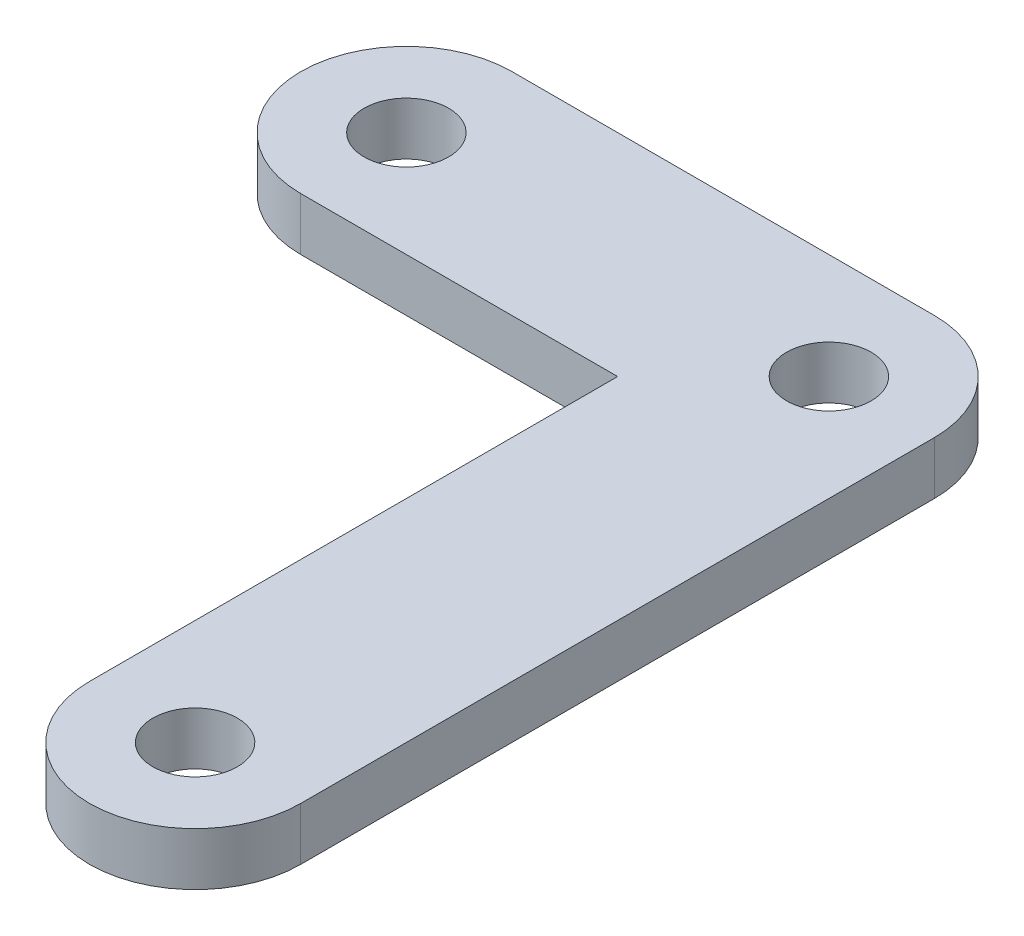
ISO-10303-21;
HEADER;
FILE_DESCRIPTION(('STEP AP214'),'2;1');
FILE_NAME('part.step','',(''),(''),'','','');
FILE_SCHEMA(('AUTOMOTIVE_DESIGN { 1 0 10303 214 1 1 1 1 }'));
ENDSEC;
DATA;
#1=APPLICATION_CONTEXT('core data for automotive mechanical design processes');
#2=APPLICATION_PROTOCOL_DEFINITION('international standard','automotive_design',2000,#1);
#3=PRODUCT_CONTEXT('',#1,'mechanical');
#4=PRODUCT('Part','Part','',(#3));
#5=PRODUCT_RELATED_PRODUCT_CATEGORY('part','',(#4));
#6=PRODUCT_DEFINITION_FORMATION('','',#4);
#7=PRODUCT_DEFINITION_CONTEXT('part definition',#1,'design');
#8=PRODUCT_DEFINITION('design','',#6,#7);
#9=PRODUCT_DEFINITION_SHAPE('','',#8);
#10=(LENGTH_UNIT() NAMED_UNIT(*) SI_UNIT(.MILLI.,.METRE.));
#11=(NAMED_UNIT(*) PLANE_ANGLE_UNIT() SI_UNIT($,.RADIAN.));
#12=(NAMED_UNIT(*) SI_UNIT($,.STERADIAN.) SOLID_ANGLE_UNIT());
#13=UNCERTAINTY_MEASURE_WITH_UNIT(LENGTH_MEASURE(1.E-05),#10,'distance_accuracy_value','');
#14=(GEOMETRIC_REPRESENTATION_CONTEXT(3) GLOBAL_UNCERTAINTY_ASSIGNED_CONTEXT((#13)) GLOBAL_UNIT_ASSIGNED_CONTEXT((#10,
#11,#12)) REPRESENTATION_CONTEXT('',''));
#15=CARTESIAN_POINT('',(0.,0.,0.));
#16=DIRECTION('',(0.,0.,1.));
#17=DIRECTION('',(1.,0.,0.));
#18=AXIS2_PLACEMENT_3D('',#15,#16,#17);
#19=CARTESIAN_POINT('',(-39.9999999999998,5.,-60.));
#20=DIRECTION('',(0.,-1.,0.));
#21=DIRECTION('',(0.,0.,-1.));
#22=AXIS2_PLACEMENT_3D('',#19,#20,#21);
#23=CYLINDRICAL_SURFACE('',#22,10.);
#24=CARTESIAN_POINT('',(-39.9999999999998,0.,-60.));
#25=DIRECTION('',(0.,1.,0.));
#26=DIRECTION('',(0.,0.,1.));
#27=AXIS2_PLACEMENT_3D('',#24,#25,#26);
#28=CIRCLE('',#27,10.);
#29=CARTESIAN_POINT('',(-40.,0.,-70.));
#30=VERTEX_POINT('',#29);
#31=CARTESIAN_POINT('',(-40.,0.,-50.));
#32=VERTEX_POINT('',#31);
#33=EDGE_CURVE('E138',#30,#32,#28,.T.);
#34=ORIENTED_EDGE('',*,*,#33,.T.);
#35=DIRECTION('',(0.,-1.,0.));
#36=VECTOR('',#35,1.);
#37=CARTESIAN_POINT('',(-40.,5.,-50.));
#38=LINE('',#37,#36);
#39=CARTESIAN_POINT('',(-40.,5.,-50.));
#40=VERTEX_POINT('',#39);
#41=EDGE_CURVE('E11',#40,#32,#38,.T.);
#42=ORIENTED_EDGE('',*,*,#41,.F.);
#43=CARTESIAN_POINT('',(-39.9999999999998,5.,-60.));
#44=DIRECTION('',(0.,1.,0.));
#45=DIRECTION('',(0.,0.,1.));
#46=AXIS2_PLACEMENT_3D('',#43,#44,#45);
#47=CIRCLE('',#46,10.);
#48=CARTESIAN_POINT('',(-40.,5.,-70.));
#49=VERTEX_POINT('',#48);
#50=EDGE_CURVE('E158',#49,#40,#47,.T.);
#51=ORIENTED_EDGE('',*,*,#50,.F.);
#52=DIRECTION('',(0.,-1.,0.));
#53=VECTOR('',#52,1.);
#54=CARTESIAN_POINT('',(-40.,5.,-70.));
#55=LINE('',#54,#53);
#56=EDGE_CURVE('E134',#49,#30,#55,.T.);
#57=ORIENTED_EDGE('',*,*,#56,.T.);
#58=EDGE_LOOP('',(#34,#42,#51,#57));
#59=FACE_BOUND('',#58,.T.);
#60=ADVANCED_FACE('F43',(#59),#23,.T.);
#61=CARTESIAN_POINT('',(-40.,5.,-50.));
#62=DIRECTION('',(0.,0.,-1.));
#63=DIRECTION('',(-1.,0.,0.));
#64=AXIS2_PLACEMENT_3D('',#61,#62,#63);
#65=PLANE('',#64);
#66=DIRECTION('',(1.,0.,0.));
#67=VECTOR('',#66,1.);
#68=CARTESIAN_POINT('',(-40.,0.,-50.));
#69=LINE('',#68,#67);
#70=CARTESIAN_POINT('',(-10.,0.,-50.));
#71=VERTEX_POINT('',#70);
#72=EDGE_CURVE('E142',#32,#71,#69,.T.);
#73=ORIENTED_EDGE('',*,*,#72,.T.);
#74=DIRECTION('',(0.,-1.,0.));
#75=VECTOR('',#74,1.);
#76=CARTESIAN_POINT('',(-10.,5.,-50.));
#77=LINE('',#76,#75);
#78=CARTESIAN_POINT('',(-10.,5.,-50.));
#79=VERTEX_POINT('',#78);
#80=EDGE_CURVE('E52',#79,#71,#77,.T.);
#81=ORIENTED_EDGE('',*,*,#80,.F.);
#82=DIRECTION('',(1.,0.,0.));
#83=VECTOR('',#82,1.);
#84=CARTESIAN_POINT('',(-40.,5.,-50.));
#85=LINE('',#84,#83);
#86=EDGE_CURVE('E100',#40,#79,#85,.T.);
#87=ORIENTED_EDGE('',*,*,#86,.F.);
#88=ORIENTED_EDGE('',*,*,#41,.T.);
#89=EDGE_LOOP('',(#73,#81,#87,#88));
#90=FACE_BOUND('',#89,.T.);
#91=ADVANCED_FACE('F242',(#90),#65,.F.);
#92=CARTESIAN_POINT('',(-10.,5.,0.));
#93=DIRECTION('',(1.,0.,0.));
#94=DIRECTION('',(0.,0.,-1.));
#95=AXIS2_PLACEMENT_3D('',#92,#93,#94);
#96=PLANE('',#95);
#97=DIRECTION('',(0.,0.,1.));
#98=VECTOR('',#97,1.);
#99=CARTESIAN_POINT('',(-10.,0.,0.));
#100=LINE('',#99,#98);
#101=CARTESIAN_POINT('',(-10.,0.,0.));
#102=VERTEX_POINT('',#101);
#103=EDGE_CURVE('E146',#71,#102,#100,.T.);
#104=ORIENTED_EDGE('',*,*,#103,.T.);
#105=DIRECTION('',(0.,-1.,0.));
#106=VECTOR('',#105,1.);
#107=CARTESIAN_POINT('',(-10.,5.,0.));
#108=LINE('',#107,#106);
#109=CARTESIAN_POINT('',(-10.,5.,0.));
#110=VERTEX_POINT('',#109);
#111=EDGE_CURVE('E165',#110,#102,#108,.T.);
#112=ORIENTED_EDGE('',*,*,#111,.F.);
#113=DIRECTION('',(0.,0.,1.));
#114=VECTOR('',#113,1.);
#115=CARTESIAN_POINT('',(-10.,5.,0.));
#116=LINE('',#115,#114);
#117=EDGE_CURVE('E175',#79,#110,#116,.T.);
#118=ORIENTED_EDGE('',*,*,#117,.F.);
#119=ORIENTED_EDGE('',*,*,#80,.T.);
#120=EDGE_LOOP('',(#104,#112,#118,#119));
#121=FACE_BOUND('',#120,.T.);
#122=ADVANCED_FACE('F173',(#121),#96,.F.);
#123=CARTESIAN_POINT('',(0.,5.,0.));
#124=DIRECTION('',(0.,-1.,0.));
#125=DIRECTION('',(0.,0.,-1.));
#126=AXIS2_PLACEMENT_3D('',#123,#124,#125);
#127=CYLINDRICAL_SURFACE('',#126,10.);
#128=CARTESIAN_POINT('',(0.,0.,0.));
#129=DIRECTION('',(0.,1.,0.));
#130=DIRECTION('',(0.,0.,1.));
#131=AXIS2_PLACEMENT_3D('',#128,#129,#130);
#132=CIRCLE('',#131,10.);
#133=CARTESIAN_POINT('',(10.,0.,0.));
#134=VERTEX_POINT('',#133);
#135=EDGE_CURVE('E149',#102,#134,#132,.T.);
#136=ORIENTED_EDGE('',*,*,#135,.T.);
#137=DIRECTION('',(0.,-1.,0.));
#138=VECTOR('',#137,1.);
#139=CARTESIAN_POINT('',(10.,5.,0.));
#140=LINE('',#139,#138);
#141=CARTESIAN_POINT('',(10.,5.,0.));
#142=VERTEX_POINT('',#141);
#143=EDGE_CURVE('E127',#142,#134,#140,.T.);
#144=ORIENTED_EDGE('',*,*,#143,.F.);
#145=CARTESIAN_POINT('',(0.,5.,0.));
#146=DIRECTION('',(0.,1.,0.));
#147=DIRECTION('',(0.,0.,1.));
#148=AXIS2_PLACEMENT_3D('',#145,#146,#147);
#149=CIRCLE('',#148,10.);
#150=EDGE_CURVE('E116',#110,#142,#149,.T.);
#151=ORIENTED_EDGE('',*,*,#150,.F.);
#152=ORIENTED_EDGE('',*,*,#111,.T.);
#153=EDGE_LOOP('',(#136,#144,#151,#152));
#154=FACE_BOUND('',#153,.T.);
#155=ADVANCED_FACE('F181',(#154),#127,.T.);
#156=CARTESIAN_POINT('',(10.,5.,-60.));
#157=DIRECTION('',(-1.,0.,0.));
#158=DIRECTION('',(0.,0.,1.));
#159=AXIS2_PLACEMENT_3D('',#156,#157,#158);
#160=PLANE('',#159);
#161=DIRECTION('',(0.,0.,-1.));
#162=VECTOR('',#161,1.);
#163=CARTESIAN_POINT('',(10.,0.,-60.));
#164=LINE('',#163,#162);
#165=CARTESIAN_POINT('',(10.,0.,-60.));
#166=VERTEX_POINT('',#165);
#167=EDGE_CURVE('E125',#134,#166,#164,.T.);
#168=ORIENTED_EDGE('',*,*,#167,.T.);
#169=DIRECTION('',(0.,-1.,0.));
#170=VECTOR('',#169,1.);
#171=CARTESIAN_POINT('',(10.,5.,-60.));
#172=LINE('',#171,#170);
#173=CARTESIAN_POINT('',(10.,5.,-60.));
#174=VERTEX_POINT('',#173);
#175=EDGE_CURVE('E122',#174,#166,#172,.T.);
#176=ORIENTED_EDGE('',*,*,#175,.F.);
#177=DIRECTION('',(0.,0.,-1.));
#178=VECTOR('',#177,1.);
#179=CARTESIAN_POINT('',(10.,5.,-60.));
#180=LINE('',#179,#178);
#181=EDGE_CURVE('E110',#142,#174,#180,.T.);
#182=ORIENTED_EDGE('',*,*,#181,.F.);
#183=ORIENTED_EDGE('',*,*,#143,.T.);
#184=EDGE_LOOP('',(#168,#176,#182,#183));
#185=FACE_BOUND('',#184,.T.);
#186=ADVANCED_FACE('F123',(#185),#160,.F.);
#187=CARTESIAN_POINT('',(0.,5.,-60.));
#188=DIRECTION('',(0.,-1.,0.));
#189=DIRECTION('',(0.,0.,-1.));
#190=AXIS2_PLACEMENT_3D('',#187,#188,#189);
#191=CYLINDRICAL_SURFACE('',#190,9.99999999999998);
#192=CARTESIAN_POINT('',(0.,0.,-60.));
#193=DIRECTION('',(0.,1.,0.));
#194=DIRECTION('',(0.,0.,-1.));
#195=AXIS2_PLACEMENT_3D('',#192,#193,#194);
#196=CIRCLE('',#195,9.99999999999998);
#197=CARTESIAN_POINT('',(0.,0.,-70.));
#198=VERTEX_POINT('',#197);
#199=EDGE_CURVE('E86',#166,#198,#196,.T.);
#200=ORIENTED_EDGE('',*,*,#199,.T.);
#201=DIRECTION('',(0.,-1.,0.));
#202=VECTOR('',#201,1.);
#203=CARTESIAN_POINT('',(0.,5.,-70.));
#204=LINE('',#203,#202);
#205=CARTESIAN_POINT('',(0.,5.,-70.));
#206=VERTEX_POINT('',#205);
#207=EDGE_CURVE('E128',#206,#198,#204,.T.);
#208=ORIENTED_EDGE('',*,*,#207,.F.);
#209=CARTESIAN_POINT('',(0.,5.,-60.));
#210=DIRECTION('',(0.,1.,0.));
#211=DIRECTION('',(0.,0.,-1.));
#212=AXIS2_PLACEMENT_3D('',#209,#210,#211);
#213=CIRCLE('',#212,9.99999999999998);
#214=EDGE_CURVE('E114',#174,#206,#213,.T.);
#215=ORIENTED_EDGE('',*,*,#214,.F.);
#216=ORIENTED_EDGE('',*,*,#175,.T.);
#217=EDGE_LOOP('',(#200,#208,#215,#216));
#218=FACE_BOUND('',#217,.T.);
#219=ADVANCED_FACE('F130',(#218),#191,.T.);
#220=CARTESIAN_POINT('',(-40.,5.,-70.));
#221=DIRECTION('',(0.,0.,1.));
#222=DIRECTION('',(1.,0.,0.));
#223=AXIS2_PLACEMENT_3D('',#220,#221,#222);
#224=PLANE('',#223);
#225=DIRECTION('',(-1.,0.,0.));
#226=VECTOR('',#225,1.);
#227=CARTESIAN_POINT('',(-40.,0.,-70.));
#228=LINE('',#227,#226);
#229=EDGE_CURVE('E92',#198,#30,#228,.T.);
#230=ORIENTED_EDGE('',*,*,#229,.T.);
#231=ORIENTED_EDGE('',*,*,#56,.F.);
#232=DIRECTION('',(-1.,0.,0.));
#233=VECTOR('',#232,1.);
#234=CARTESIAN_POINT('',(-40.,5.,-70.));
#235=LINE('',#234,#233);
#236=EDGE_CURVE('E60',#206,#49,#235,.T.);
#237=ORIENTED_EDGE('',*,*,#236,.F.);
#238=ORIENTED_EDGE('',*,*,#207,.T.);
#239=EDGE_LOOP('',(#230,#231,#237,#238));
#240=FACE_BOUND('',#239,.T.);
#241=ADVANCED_FACE('F249',(#240),#224,.F.);
#242=CARTESIAN_POINT('',(-39.9999999999998,5.,-60.));
#243=DIRECTION('',(0.,1.,0.));
#244=DIRECTION('',(0.,0.,1.));
#245=AXIS2_PLACEMENT_3D('',#242,#243,#244);
#246=PLANE('',#245);
#247=CARTESIAN_POINT('',(0.,5.,0.));
#248=DIRECTION('',(0.,-1.,0.));
#249=DIRECTION('',(0.,0.,-1.));
#250=AXIS2_PLACEMENT_3D('',#247,#248,#249);
#251=CIRCLE('',#250,4.);
#252=CARTESIAN_POINT('',(0.,5.,-4.));
#253=VERTEX_POINT('',#252);
#254=EDGE_CURVE('E143',#253,#253,#251,.T.);
#255=ORIENTED_EDGE('',*,*,#254,.T.);
#256=EDGE_LOOP('',(#255));
#257=FACE_BOUND('',#256,.T.);
#258=CARTESIAN_POINT('',(-39.9999999999998,5.,-60.));
#259=DIRECTION('',(0.,-1.,0.));
#260=DIRECTION('',(0.,0.,-1.));
#261=AXIS2_PLACEMENT_3D('',#258,#259,#260);
#262=CIRCLE('',#261,4.00000000000001);
#263=CARTESIAN_POINT('',(-39.9999999999998,5.,-64.));
#264=VERTEX_POINT('',#263);
#265=EDGE_CURVE('E198',#264,#264,#262,.T.);
#266=ORIENTED_EDGE('',*,*,#265,.T.);
#267=EDGE_LOOP('',(#266));
#268=FACE_BOUND('',#267,.T.);
#269=CARTESIAN_POINT('',(0.,5.,-60.));
#270=DIRECTION('',(0.,-1.,0.));
#271=DIRECTION('',(0.,0.,-1.));
#272=AXIS2_PLACEMENT_3D('',#269,#270,#271);
#273=CIRCLE('',#272,4.);
#274=CARTESIAN_POINT('',(0.,5.,-64.));
#275=VERTEX_POINT('',#274);
#276=EDGE_CURVE('E190',#275,#275,#273,.T.);
#277=ORIENTED_EDGE('',*,*,#276,.T.);
#278=EDGE_LOOP('',(#277));
#279=FACE_BOUND('',#278,.T.);
#280=ORIENTED_EDGE('',*,*,#50,.T.);
#281=ORIENTED_EDGE('',*,*,#86,.T.);
#282=ORIENTED_EDGE('',*,*,#117,.T.);
#283=ORIENTED_EDGE('',*,*,#150,.T.);
#284=ORIENTED_EDGE('',*,*,#181,.T.);
#285=ORIENTED_EDGE('',*,*,#214,.T.);
#286=ORIENTED_EDGE('',*,*,#236,.T.);
#287=EDGE_LOOP('',(#280,#281,#282,#283,#284,#285,#286));
#288=FACE_BOUND('',#287,.T.);
#289=ADVANCED_FACE('F112',(#257,#268,#279,#288),#246,.T.);
#290=CARTESIAN_POINT('',(-39.9999999999998,0.,-60.));
#291=DIRECTION('',(0.,1.,0.));
#292=DIRECTION('',(0.,0.,1.));
#293=AXIS2_PLACEMENT_3D('',#290,#291,#292);
#294=PLANE('',#293);
#295=CARTESIAN_POINT('',(0.,0.,0.));
#296=DIRECTION('',(0.,-1.,0.));
#297=DIRECTION('',(0.,0.,-1.));
#298=AXIS2_PLACEMENT_3D('',#295,#296,#297);
#299=CIRCLE('',#298,4.);
#300=CARTESIAN_POINT('',(0.,0.,-4.));
#301=VERTEX_POINT('',#300);
#302=EDGE_CURVE('E206',#301,#301,#299,.T.);
#303=ORIENTED_EDGE('',*,*,#302,.F.);
#304=EDGE_LOOP('',(#303));
#305=FACE_BOUND('',#304,.T.);
#306=CARTESIAN_POINT('',(-39.9999999999998,0.,-60.));
#307=DIRECTION('',(0.,-1.,0.));
#308=DIRECTION('',(0.,0.,-1.));
#309=AXIS2_PLACEMENT_3D('',#306,#307,#308);
#310=CIRCLE('',#309,4.00000000000001);
#311=CARTESIAN_POINT('',(-39.9999999999998,0.,-64.));
#312=VERTEX_POINT('',#311);
#313=EDGE_CURVE('E202',#312,#312,#310,.T.);
#314=ORIENTED_EDGE('',*,*,#313,.F.);
#315=EDGE_LOOP('',(#314));
#316=FACE_BOUND('',#315,.T.);
#317=CARTESIAN_POINT('',(0.,0.,-60.));
#318=DIRECTION('',(0.,-1.,0.));
#319=DIRECTION('',(0.,0.,-1.));
#320=AXIS2_PLACEMENT_3D('',#317,#318,#319);
#321=CIRCLE('',#320,4.);
#322=CARTESIAN_POINT('',(0.,0.,-64.));
#323=VERTEX_POINT('',#322);
#324=EDGE_CURVE('E194',#323,#323,#321,.T.);
#325=ORIENTED_EDGE('',*,*,#324,.F.);
#326=EDGE_LOOP('',(#325));
#327=FACE_BOUND('',#326,.T.);
#328=ORIENTED_EDGE('',*,*,#33,.F.);
#329=ORIENTED_EDGE('',*,*,#229,.F.);
#330=ORIENTED_EDGE('',*,*,#199,.F.);
#331=ORIENTED_EDGE('',*,*,#167,.F.);
#332=ORIENTED_EDGE('',*,*,#135,.F.);
#333=ORIENTED_EDGE('',*,*,#103,.F.);
#334=ORIENTED_EDGE('',*,*,#72,.F.);
#335=EDGE_LOOP('',(#328,#329,#330,#331,#332,#333,#334));
#336=FACE_BOUND('',#335,.T.);
#337=ADVANCED_FACE('F179',(#305,#316,#327,#336),#294,.F.);
#338=CARTESIAN_POINT('',(0.,5.,-60.));
#339=DIRECTION('',(0.,-1.,0.));
#340=DIRECTION('',(0.,0.,-1.));
#341=AXIS2_PLACEMENT_3D('',#338,#339,#340);
#342=CYLINDRICAL_SURFACE('',#341,4.);
#343=ORIENTED_EDGE('',*,*,#276,.F.);
#344=EDGE_LOOP('',(#343));
#345=FACE_BOUND('',#344,.T.);
#346=ORIENTED_EDGE('',*,*,#324,.T.);
#347=EDGE_LOOP('',(#346));
#348=FACE_BOUND('',#347,.T.);
#349=ADVANCED_FACE('F225',(#345,#348),#342,.F.);
#350=CARTESIAN_POINT('',(-39.9999999999998,5.,-60.));
#351=DIRECTION('',(0.,-1.,0.));
#352=DIRECTION('',(0.,0.,-1.));
#353=AXIS2_PLACEMENT_3D('',#350,#351,#352);
#354=CYLINDRICAL_SURFACE('',#353,4.00000000000001);
#355=ORIENTED_EDGE('',*,*,#265,.F.);
#356=EDGE_LOOP('',(#355));
#357=FACE_BOUND('',#356,.T.);
#358=ORIENTED_EDGE('',*,*,#313,.T.);
#359=EDGE_LOOP('',(#358));
#360=FACE_BOUND('',#359,.T.);
#361=ADVANCED_FACE('F219',(#357,#360),#354,.F.);
#362=CARTESIAN_POINT('',(0.,5.,0.));
#363=DIRECTION('',(0.,-1.,0.));
#364=DIRECTION('',(0.,0.,-1.));
#365=AXIS2_PLACEMENT_3D('',#362,#363,#364);
#366=CYLINDRICAL_SURFACE('',#365,4.);
#367=ORIENTED_EDGE('',*,*,#254,.F.);
#368=EDGE_LOOP('',(#367));
#369=FACE_BOUND('',#368,.T.);
#370=ORIENTED_EDGE('',*,*,#302,.T.);
#371=EDGE_LOOP('',(#370));
#372=FACE_BOUND('',#371,.T.);
#373=ADVANCED_FACE('F216',(#369,#372),#366,.F.);
#374=CLOSED_SHELL('',(#60,#91,#122,#155,#186,#219,#241,#289,#337,#349,#361,#373));
#375=MANIFOLD_SOLID_BREP('B2',#374);
#376=ADVANCED_BREP_SHAPE_REPRESENTATION('',(#18,#375),#14);
#377=SHAPE_DEFINITION_REPRESENTATION(#9,#376);
ENDSEC;
END-ISO-10303-21;
